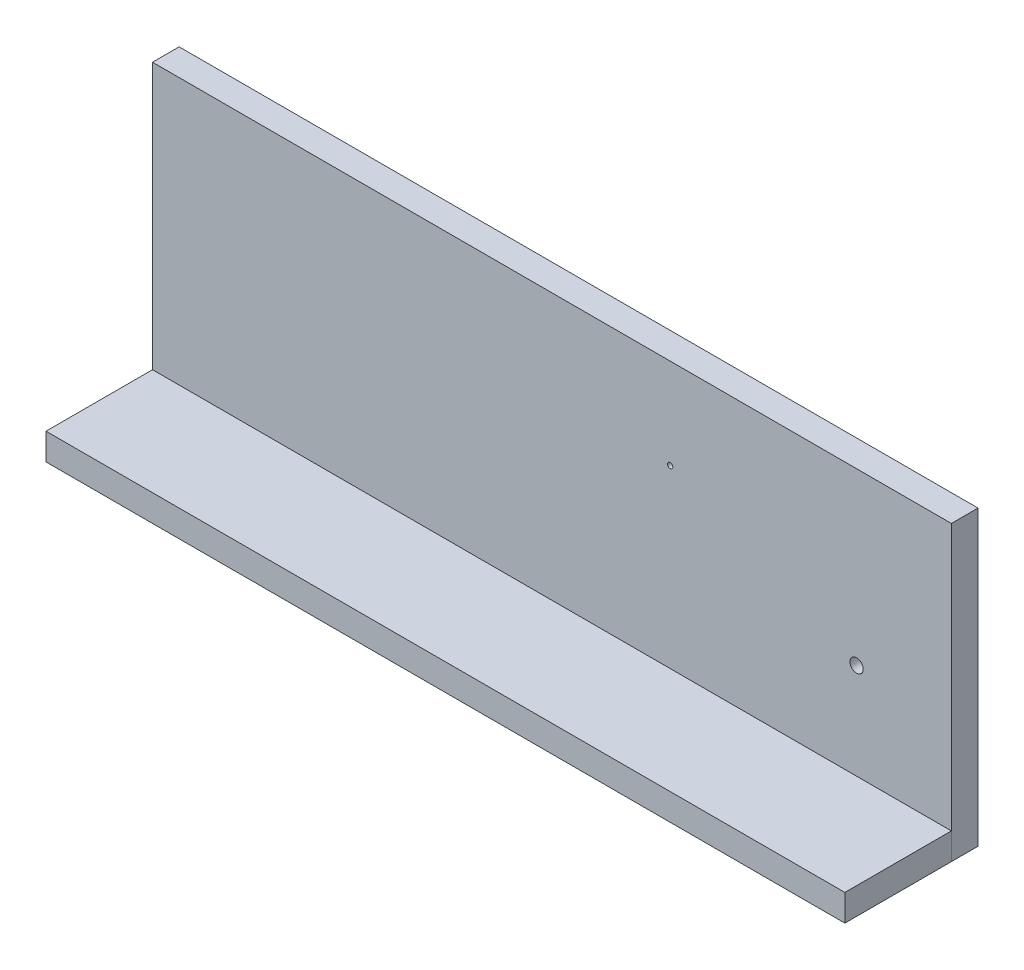
ISO-10303-21;
HEADER;
FILE_DESCRIPTION(('STEP AP214'),'2;1');
FILE_NAME('part.step','',(''),(''),'','','');
FILE_SCHEMA(('AUTOMOTIVE_DESIGN { 1 0 10303 214 1 1 1 1 }'));
ENDSEC;
DATA;
#1=APPLICATION_CONTEXT('core data for automotive mechanical design processes');
#2=APPLICATION_PROTOCOL_DEFINITION('international standard','automotive_design',2000,#1);
#3=PRODUCT_CONTEXT('',#1,'mechanical');
#4=PRODUCT('Part','Part','',(#3));
#5=PRODUCT_RELATED_PRODUCT_CATEGORY('part','',(#4));
#6=PRODUCT_DEFINITION_FORMATION('','',#4);
#7=PRODUCT_DEFINITION_CONTEXT('part definition',#1,'design');
#8=PRODUCT_DEFINITION('design','',#6,#7);
#9=PRODUCT_DEFINITION_SHAPE('','',#8);
#10=(LENGTH_UNIT() NAMED_UNIT(*) SI_UNIT(.MILLI.,.METRE.));
#11=(NAMED_UNIT(*) PLANE_ANGLE_UNIT() SI_UNIT($,.RADIAN.));
#12=(NAMED_UNIT(*) SI_UNIT($,.STERADIAN.) SOLID_ANGLE_UNIT());
#13=UNCERTAINTY_MEASURE_WITH_UNIT(LENGTH_MEASURE(1.E-05),#10,'distance_accuracy_value','');
#14=(GEOMETRIC_REPRESENTATION_CONTEXT(3) GLOBAL_UNCERTAINTY_ASSIGNED_CONTEXT((#13)) GLOBAL_UNIT_ASSIGNED_CONTEXT((#10,
#11,#12)) REPRESENTATION_CONTEXT('',''));
#15=CARTESIAN_POINT('',(0.,0.,0.));
#16=DIRECTION('',(0.,0.,1.));
#17=DIRECTION('',(1.,0.,0.));
#18=AXIS2_PLACEMENT_3D('',#15,#16,#17);
#19=CARTESIAN_POINT('',(1500.,1.22464679914735E-13,200.));
#20=DIRECTION('',(-1.,0.,0.));
#21=DIRECTION('',(0.,0.,1.));
#22=AXIS2_PLACEMENT_3D('',#19,#20,#21);
#23=PLANE('',#22);
#24=DIRECTION('',(0.,1.,0.));
#25=VECTOR('',#24,1.);
#26=CARTESIAN_POINT('',(1500.,1.22464679914735E-13,0.));
#27=LINE('',#26,#25);
#28=CARTESIAN_POINT('',(1500.,1.22464679914735E-13,0.));
#29=VERTEX_POINT('',#28);
#30=CARTESIAN_POINT('',(1500.,50.,0.));
#31=VERTEX_POINT('',#30);
#32=EDGE_CURVE('E106',#29,#31,#27,.T.);
#33=ORIENTED_EDGE('',*,*,#32,.T.);
#34=DIRECTION('',(0.,0.,-1.));
#35=VECTOR('',#34,1.);
#36=CARTESIAN_POINT('',(1500.,50.,200.));
#37=LINE('',#36,#35);
#38=CARTESIAN_POINT('',(1500.,50.,200.));
#39=VERTEX_POINT('',#38);
#40=EDGE_CURVE('E12',#39,#31,#37,.T.);
#41=ORIENTED_EDGE('',*,*,#40,.F.);
#42=DIRECTION('',(0.,1.,0.));
#43=VECTOR('',#42,1.);
#44=CARTESIAN_POINT('',(1500.,1.22464679914735E-13,200.));
#45=LINE('',#44,#43);
#46=CARTESIAN_POINT('',(1500.,1.22464679914735E-13,200.));
#47=VERTEX_POINT('',#46);
#48=EDGE_CURVE('E94',#47,#39,#45,.T.);
#49=ORIENTED_EDGE('',*,*,#48,.F.);
#50=DIRECTION('',(0.,0.,-1.));
#51=VECTOR('',#50,1.);
#52=CARTESIAN_POINT('',(1500.,1.22464679914735E-13,200.));
#53=LINE('',#52,#51);
#54=EDGE_CURVE('E102',#47,#29,#53,.T.);
#55=ORIENTED_EDGE('',*,*,#54,.T.);
#56=EDGE_LOOP('',(#33,#41,#49,#55));
#57=FACE_BOUND('',#56,.T.);
#58=ADVANCED_FACE('F43',(#57),#23,.F.);
#59=CARTESIAN_POINT('',(1500.,50.,200.));
#60=DIRECTION('',(0.,-1.,0.));
#61=DIRECTION('',(1.,0.,0.));
#62=AXIS2_PLACEMENT_3D('',#59,#60,#61);
#63=PLANE('',#62);
#64=DIRECTION('',(-1.,0.,0.));
#65=VECTOR('',#64,1.);
#66=CARTESIAN_POINT('',(1500.,50.,0.));
#67=LINE('',#66,#65);
#68=CARTESIAN_POINT('',(0.,49.9999999999999,0.));
#69=VERTEX_POINT('',#68);
#70=EDGE_CURVE('E98',#31,#69,#67,.T.);
#71=ORIENTED_EDGE('',*,*,#70,.T.);
#72=DIRECTION('',(0.,0.,-1.));
#73=VECTOR('',#72,1.);
#74=CARTESIAN_POINT('',(0.,49.9999999999999,200.));
#75=LINE('',#74,#73);
#76=CARTESIAN_POINT('',(0.,49.9999999999999,200.));
#77=VERTEX_POINT('',#76);
#78=EDGE_CURVE('E51',#77,#69,#75,.T.);
#79=ORIENTED_EDGE('',*,*,#78,.F.);
#80=DIRECTION('',(-1.,0.,0.));
#81=VECTOR('',#80,1.);
#82=CARTESIAN_POINT('',(1500.,50.,200.));
#83=LINE('',#82,#81);
#84=EDGE_CURVE('E89',#39,#77,#83,.T.);
#85=ORIENTED_EDGE('',*,*,#84,.F.);
#86=ORIENTED_EDGE('',*,*,#40,.T.);
#87=EDGE_LOOP('',(#71,#79,#85,#86));
#88=FACE_BOUND('',#87,.T.);
#89=ADVANCED_FACE('F97',(#88),#63,.F.);
#90=CARTESIAN_POINT('',(0.,-1.22464679914735E-13,200.));
#91=DIRECTION('',(1.,0.,0.));
#92=DIRECTION('',(0.,0.,-1.));
#93=AXIS2_PLACEMENT_3D('',#90,#91,#92);
#94=PLANE('',#93);
#95=DIRECTION('',(0.,-1.,0.));
#96=VECTOR('',#95,1.);
#97=CARTESIAN_POINT('',(0.,-1.22464679914735E-13,0.));
#98=LINE('',#97,#96);
#99=CARTESIAN_POINT('',(0.,-1.22464679914735E-13,0.));
#100=VERTEX_POINT('',#99);
#101=EDGE_CURVE('E76',#69,#100,#98,.T.);
#102=ORIENTED_EDGE('',*,*,#101,.T.);
#103=DIRECTION('',(0.,0.,-1.));
#104=VECTOR('',#103,1.);
#105=CARTESIAN_POINT('',(0.,-1.22464679914735E-13,200.));
#106=LINE('',#105,#104);
#107=CARTESIAN_POINT('',(0.,-1.22464679914735E-13,200.));
#108=VERTEX_POINT('',#107);
#109=EDGE_CURVE('E99',#108,#100,#106,.T.);
#110=ORIENTED_EDGE('',*,*,#109,.F.);
#111=DIRECTION('',(0.,-1.,0.));
#112=VECTOR('',#111,1.);
#113=CARTESIAN_POINT('',(0.,-1.22464679914735E-13,200.));
#114=LINE('',#113,#112);
#115=EDGE_CURVE('E92',#77,#108,#114,.T.);
#116=ORIENTED_EDGE('',*,*,#115,.F.);
#117=ORIENTED_EDGE('',*,*,#78,.T.);
#118=EDGE_LOOP('',(#102,#110,#116,#117));
#119=FACE_BOUND('',#118,.T.);
#120=ADVANCED_FACE('F100',(#119),#94,.F.);
#121=CARTESIAN_POINT('',(1500.,1.22464679914735E-13,200.));
#122=DIRECTION('',(0.,1.,0.));
#123=DIRECTION('',(-1.,0.,0.));
#124=AXIS2_PLACEMENT_3D('',#121,#122,#123);
#125=PLANE('',#124);
#126=DIRECTION('',(1.,0.,0.));
#127=VECTOR('',#126,1.);
#128=CARTESIAN_POINT('',(1500.,1.22464679914735E-13,0.));
#129=LINE('',#128,#127);
#130=EDGE_CURVE('E82',#100,#29,#129,.T.);
#131=ORIENTED_EDGE('',*,*,#130,.T.);
#132=ORIENTED_EDGE('',*,*,#54,.F.);
#133=DIRECTION('',(1.,0.,0.));
#134=VECTOR('',#133,1.);
#135=CARTESIAN_POINT('',(1500.,1.22464679914735E-13,200.));
#136=LINE('',#135,#134);
#137=EDGE_CURVE('E59',#108,#47,#136,.T.);
#138=ORIENTED_EDGE('',*,*,#137,.F.);
#139=ORIENTED_EDGE('',*,*,#109,.T.);
#140=EDGE_LOOP('',(#131,#132,#138,#139));
#141=FACE_BOUND('',#140,.T.);
#142=ADVANCED_FACE('F113',(#141),#125,.F.);
#143=CARTESIAN_POINT('',(0.,0.,200.));
#144=DIRECTION('',(0.,0.,1.));
#145=DIRECTION('',(1.,0.,0.));
#146=AXIS2_PLACEMENT_3D('',#143,#144,#145);
#147=PLANE('',#146);
#148=ORIENTED_EDGE('',*,*,#48,.T.);
#149=ORIENTED_EDGE('',*,*,#84,.T.);
#150=ORIENTED_EDGE('',*,*,#115,.T.);
#151=ORIENTED_EDGE('',*,*,#137,.T.);
#152=EDGE_LOOP('',(#148,#149,#150,#151));
#153=FACE_BOUND('',#152,.T.);
#154=ADVANCED_FACE('F90',(#153),#147,.T.);
#155=CARTESIAN_POINT('',(0.,0.,0.));
#156=DIRECTION('',(0.,0.,1.));
#157=DIRECTION('',(1.,0.,0.));
#158=AXIS2_PLACEMENT_3D('',#155,#156,#157);
#159=PLANE('',#158);
#160=ORIENTED_EDGE('',*,*,#32,.F.);
#161=ORIENTED_EDGE('',*,*,#130,.F.);
#162=ORIENTED_EDGE('',*,*,#101,.F.);
#163=ORIENTED_EDGE('',*,*,#70,.F.);
#164=EDGE_LOOP('',(#160,#161,#162,#163));
#165=FACE_BOUND('',#164,.T.);
#166=ADVANCED_FACE('F116',(#165),#159,.F.);
#167=CLOSED_SHELL('',(#58,#89,#120,#142,#154,#166));
#168=MANIFOLD_SOLID_BREP('B2',#167);
#169=CARTESIAN_POINT('',(1500.,1.22464679914735E-13,-50.));
#170=DIRECTION('',(0.,-1.,0.));
#171=DIRECTION('',(1.,0.,0.));
#172=AXIS2_PLACEMENT_3D('',#169,#170,#171);
#173=PLANE('',#172);
#174=DIRECTION('',(1.,0.,0.));
#175=VECTOR('',#174,1.);
#176=CARTESIAN_POINT('',(1500.,1.22464679914735E-13,0.));
#177=LINE('',#176,#175);
#178=CARTESIAN_POINT('',(0.,0.,0.));
#179=VERTEX_POINT('',#178);
#180=CARTESIAN_POINT('',(1500.,1.22464679914735E-13,0.));
#181=VERTEX_POINT('',#180);
#182=EDGE_CURVE('E232',#179,#181,#177,.T.);
#183=ORIENTED_EDGE('',*,*,#182,.F.);
#184=DIRECTION('',(0.,0.,1.));
#185=VECTOR('',#184,1.);
#186=CARTESIAN_POINT('',(0.,0.,-50.));
#187=LINE('',#186,#185);
#188=CARTESIAN_POINT('',(0.,0.,-50.));
#189=VERTEX_POINT('',#188);
#190=EDGE_CURVE('E41',#189,#179,#187,.T.);
#191=ORIENTED_EDGE('',*,*,#190,.F.);
#192=DIRECTION('',(1.,0.,0.));
#193=VECTOR('',#192,1.);
#194=CARTESIAN_POINT('',(1500.,1.22464679914735E-13,-50.));
#195=LINE('',#194,#193);
#196=CARTESIAN_POINT('',(1500.,1.22464679914735E-13,-50.));
#197=VERTEX_POINT('',#196);
#198=EDGE_CURVE('E225',#189,#197,#195,.T.);
#199=ORIENTED_EDGE('',*,*,#198,.T.);
#200=DIRECTION('',(0.,0.,1.));
#201=VECTOR('',#200,1.);
#202=CARTESIAN_POINT('',(1500.,1.22464679914735E-13,-50.));
#203=LINE('',#202,#201);
#204=EDGE_CURVE('E170',#197,#181,#203,.T.);
#205=ORIENTED_EDGE('',*,*,#204,.T.);
#206=EDGE_LOOP('',(#183,#191,#199,#205));
#207=FACE_BOUND('',#206,.T.);
#208=ADVANCED_FACE('F167',(#207),#173,.T.);
#209=CARTESIAN_POINT('',(0.,0.,-50.));
#210=DIRECTION('',(-1.,0.,0.));
#211=DIRECTION('',(0.,0.,1.));
#212=AXIS2_PLACEMENT_3D('',#209,#210,#211);
#213=PLANE('',#212);
#214=DIRECTION('',(0.,-1.,0.));
#215=VECTOR('',#214,1.);
#216=CARTESIAN_POINT('',(0.,0.,0.));
#217=LINE('',#216,#215);
#218=CARTESIAN_POINT('',(0.,550.,0.));
#219=VERTEX_POINT('',#218);
#220=EDGE_CURVE('E227',#219,#179,#217,.T.);
#221=ORIENTED_EDGE('',*,*,#220,.F.);
#222=DIRECTION('',(0.,0.,1.));
#223=VECTOR('',#222,1.);
#224=CARTESIAN_POINT('',(0.,550.,-50.));
#225=LINE('',#224,#223);
#226=CARTESIAN_POINT('',(0.,550.,-50.));
#227=VERTEX_POINT('',#226);
#228=EDGE_CURVE('E176',#227,#219,#225,.T.);
#229=ORIENTED_EDGE('',*,*,#228,.F.);
#230=DIRECTION('',(0.,-1.,0.));
#231=VECTOR('',#230,1.);
#232=CARTESIAN_POINT('',(0.,0.,-50.));
#233=LINE('',#232,#231);
#234=EDGE_CURVE('E222',#227,#189,#233,.T.);
#235=ORIENTED_EDGE('',*,*,#234,.T.);
#236=ORIENTED_EDGE('',*,*,#190,.T.);
#237=EDGE_LOOP('',(#221,#229,#235,#236));
#238=FACE_BOUND('',#237,.T.);
#239=ADVANCED_FACE('F243',(#238),#213,.T.);
#240=CARTESIAN_POINT('',(0.,550.,-50.));
#241=DIRECTION('',(0.,1.,0.));
#242=DIRECTION('',(0.,0.,1.));
#243=AXIS2_PLACEMENT_3D('',#240,#241,#242);
#244=PLANE('',#243);
#245=DIRECTION('',(-1.,0.,0.));
#246=VECTOR('',#245,1.);
#247=CARTESIAN_POINT('',(0.,550.,0.));
#248=LINE('',#247,#246);
#249=CARTESIAN_POINT('',(1500.,550.,0.));
#250=VERTEX_POINT('',#249);
#251=EDGE_CURVE('E217',#250,#219,#248,.T.);
#252=ORIENTED_EDGE('',*,*,#251,.F.);
#253=DIRECTION('',(0.,0.,1.));
#254=VECTOR('',#253,1.);
#255=CARTESIAN_POINT('',(1500.,550.,-50.));
#256=LINE('',#255,#254);
#257=CARTESIAN_POINT('',(1500.,550.,-50.));
#258=VERTEX_POINT('',#257);
#259=EDGE_CURVE('E212',#258,#250,#256,.T.);
#260=ORIENTED_EDGE('',*,*,#259,.F.);
#261=DIRECTION('',(-1.,0.,0.));
#262=VECTOR('',#261,1.);
#263=CARTESIAN_POINT('',(0.,550.,-50.));
#264=LINE('',#263,#262);
#265=EDGE_CURVE('E215',#258,#227,#264,.T.);
#266=ORIENTED_EDGE('',*,*,#265,.T.);
#267=ORIENTED_EDGE('',*,*,#228,.T.);
#268=EDGE_LOOP('',(#252,#260,#266,#267));
#269=FACE_BOUND('',#268,.T.);
#270=ADVANCED_FACE('F214',(#269),#244,.T.);
#271=CARTESIAN_POINT('',(1500.,550.,-50.));
#272=DIRECTION('',(1.,0.,0.));
#273=DIRECTION('',(0.,0.,-1.));
#274=AXIS2_PLACEMENT_3D('',#271,#272,#273);
#275=PLANE('',#274);
#276=DIRECTION('',(0.,1.,0.));
#277=VECTOR('',#276,1.);
#278=CARTESIAN_POINT('',(1500.,550.,0.));
#279=LINE('',#278,#277);
#280=EDGE_CURVE('E235',#181,#250,#279,.T.);
#281=ORIENTED_EDGE('',*,*,#280,.F.);
#282=ORIENTED_EDGE('',*,*,#204,.F.);
#283=DIRECTION('',(0.,1.,0.));
#284=VECTOR('',#283,1.);
#285=CARTESIAN_POINT('',(1500.,550.,-50.));
#286=LINE('',#285,#284);
#287=EDGE_CURVE('E221',#197,#258,#286,.T.);
#288=ORIENTED_EDGE('',*,*,#287,.T.);
#289=ORIENTED_EDGE('',*,*,#259,.T.);
#290=EDGE_LOOP('',(#281,#282,#288,#289));
#291=FACE_BOUND('',#290,.T.);
#292=ADVANCED_FACE('F224',(#291),#275,.T.);
#293=CARTESIAN_POINT('',(0.,0.,-50.));
#294=DIRECTION('',(0.,0.,-1.));
#295=DIRECTION('',(-1.,0.,0.));
#296=AXIS2_PLACEMENT_3D('',#293,#294,#295);
#297=PLANE('',#296);
#298=CARTESIAN_POINT('',(972.,380.,-50.));
#299=DIRECTION('',(0.,0.,1.));
#300=DIRECTION('',(1.,0.,0.));
#301=AXIS2_PLACEMENT_3D('',#298,#299,#300);
#302=CIRCLE('',#301,5.00000000000005);
#303=CARTESIAN_POINT('',(977.,380.,-50.));
#304=VERTEX_POINT('',#303);
#305=EDGE_CURVE('E236',#304,#304,#302,.T.);
#306=ORIENTED_EDGE('',*,*,#305,.T.);
#307=EDGE_LOOP('',(#306));
#308=FACE_BOUND('',#307,.T.);
#309=CARTESIAN_POINT('',(1322.,230.,-50.));
#310=DIRECTION('',(0.,0.,1.));
#311=DIRECTION('',(1.,0.,0.));
#312=AXIS2_PLACEMENT_3D('',#309,#310,#311);
#313=CIRCLE('',#312,12.5);
#314=CARTESIAN_POINT('',(1334.5,230.,-50.));
#315=VERTEX_POINT('',#314);
#316=EDGE_CURVE('E279',#315,#315,#313,.T.);
#317=ORIENTED_EDGE('',*,*,#316,.T.);
#318=EDGE_LOOP('',(#317));
#319=FACE_BOUND('',#318,.T.);
#320=ORIENTED_EDGE('',*,*,#198,.F.);
#321=ORIENTED_EDGE('',*,*,#234,.F.);
#322=ORIENTED_EDGE('',*,*,#265,.F.);
#323=ORIENTED_EDGE('',*,*,#287,.F.);
#324=EDGE_LOOP('',(#320,#321,#322,#323));
#325=FACE_BOUND('',#324,.T.);
#326=ADVANCED_FACE('F220',(#308,#319,#325),#297,.T.);
#327=CARTESIAN_POINT('',(0.,0.,0.));
#328=DIRECTION('',(0.,0.,-1.));
#329=DIRECTION('',(-1.,0.,0.));
#330=AXIS2_PLACEMENT_3D('',#327,#328,#329);
#331=PLANE('',#330);
#332=CARTESIAN_POINT('',(972.,380.,0.));
#333=DIRECTION('',(0.,0.,1.));
#334=DIRECTION('',(1.,0.,0.));
#335=AXIS2_PLACEMENT_3D('',#332,#333,#334);
#336=CIRCLE('',#335,5.00000000000005);
#337=CARTESIAN_POINT('',(977.,380.,0.));
#338=VERTEX_POINT('',#337);
#339=EDGE_CURVE('E278',#338,#338,#336,.T.);
#340=ORIENTED_EDGE('',*,*,#339,.F.);
#341=EDGE_LOOP('',(#340));
#342=FACE_BOUND('',#341,.T.);
#343=CARTESIAN_POINT('',(1322.,230.,0.));
#344=DIRECTION('',(0.,0.,1.));
#345=DIRECTION('',(1.,0.,0.));
#346=AXIS2_PLACEMENT_3D('',#343,#344,#345);
#347=CIRCLE('',#346,12.5);
#348=CARTESIAN_POINT('',(1334.5,230.,0.));
#349=VERTEX_POINT('',#348);
#350=EDGE_CURVE('E283',#349,#349,#347,.T.);
#351=ORIENTED_EDGE('',*,*,#350,.F.);
#352=EDGE_LOOP('',(#351));
#353=FACE_BOUND('',#352,.T.);
#354=ORIENTED_EDGE('',*,*,#182,.T.);
#355=ORIENTED_EDGE('',*,*,#280,.T.);
#356=ORIENTED_EDGE('',*,*,#251,.T.);
#357=ORIENTED_EDGE('',*,*,#220,.T.);
#358=EDGE_LOOP('',(#354,#355,#356,#357));
#359=FACE_BOUND('',#358,.T.);
#360=ADVANCED_FACE('F242',(#342,#353,#359),#331,.F.);
#361=CARTESIAN_POINT('',(1322.,230.,-50.));
#362=DIRECTION('',(0.,0.,1.));
#363=DIRECTION('',(1.,0.,0.));
#364=AXIS2_PLACEMENT_3D('',#361,#362,#363);
#365=CYLINDRICAL_SURFACE('',#364,12.5);
#366=ORIENTED_EDGE('',*,*,#316,.F.);
#367=EDGE_LOOP('',(#366));
#368=FACE_BOUND('',#367,.T.);
#369=ORIENTED_EDGE('',*,*,#350,.T.);
#370=EDGE_LOOP('',(#369));
#371=FACE_BOUND('',#370,.T.);
#372=ADVANCED_FACE('F261',(#368,#371),#365,.F.);
#373=CARTESIAN_POINT('',(972.,380.,-50.));
#374=DIRECTION('',(0.,0.,1.));
#375=DIRECTION('',(1.,0.,0.));
#376=AXIS2_PLACEMENT_3D('',#373,#374,#375);
#377=CYLINDRICAL_SURFACE('',#376,5.00000000000005);
#378=ORIENTED_EDGE('',*,*,#305,.F.);
#379=EDGE_LOOP('',(#378));
#380=FACE_BOUND('',#379,.T.);
#381=ORIENTED_EDGE('',*,*,#339,.T.);
#382=EDGE_LOOP('',(#381));
#383=FACE_BOUND('',#382,.T.);
#384=ADVANCED_FACE('F268',(#380,#383),#377,.F.);
#385=CLOSED_SHELL('',(#208,#239,#270,#292,#326,#360,#372,#384));
#386=MANIFOLD_SOLID_BREP('B6',#385);
#387=ADVANCED_BREP_SHAPE_REPRESENTATION('',(#18,#168,#386),#14);
#388=SHAPE_DEFINITION_REPRESENTATION(#9,#387);
ENDSEC;
END-ISO-10303-21;
